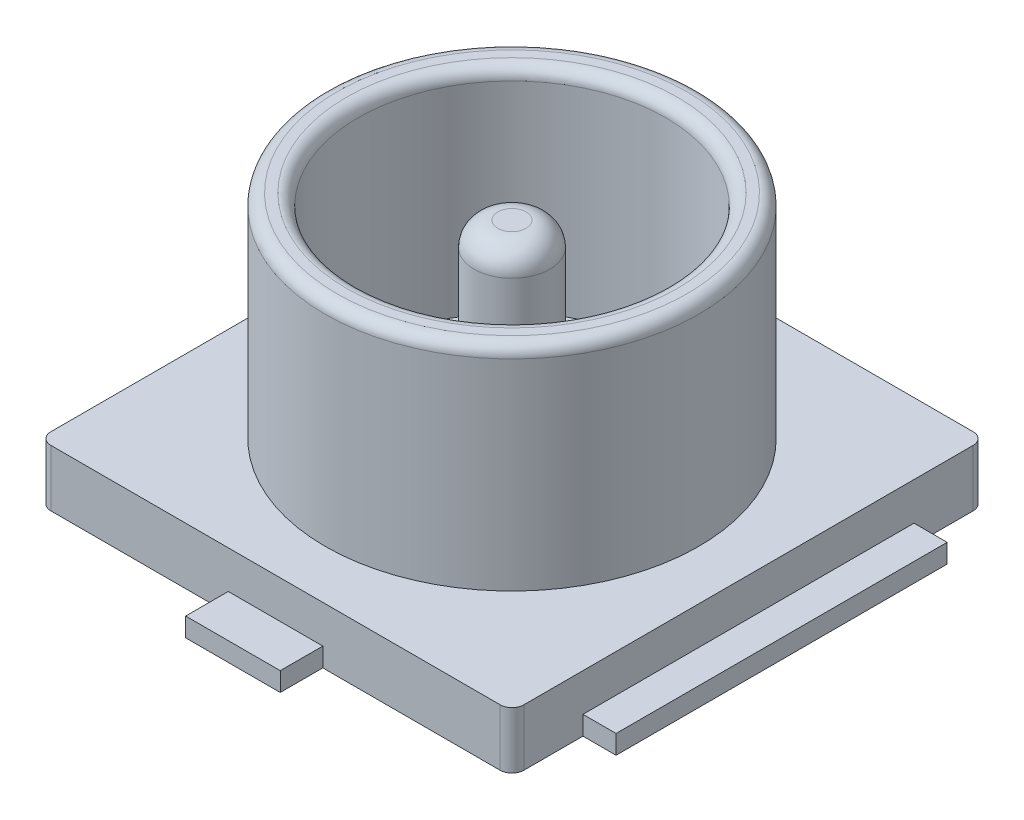
ISO-10303-21;
HEADER;
FILE_DESCRIPTION(('STEP AP214'),'2;1');
FILE_NAME('part.step','',(''),(''),'','','');
FILE_SCHEMA(('AUTOMOTIVE_DESIGN { 1 0 10303 214 1 1 1 1 }'));
ENDSEC;
DATA;
#1=APPLICATION_CONTEXT('core data for automotive mechanical design processes');
#2=APPLICATION_PROTOCOL_DEFINITION('international standard','automotive_design',2000,#1);
#3=PRODUCT_CONTEXT('',#1,'mechanical');
#4=PRODUCT('Part','Part','',(#3));
#5=PRODUCT_RELATED_PRODUCT_CATEGORY('part','',(#4));
#6=PRODUCT_DEFINITION_FORMATION('','',#4);
#7=PRODUCT_DEFINITION_CONTEXT('part definition',#1,'design');
#8=PRODUCT_DEFINITION('design','',#6,#7);
#9=PRODUCT_DEFINITION_SHAPE('','',#8);
#10=(LENGTH_UNIT() NAMED_UNIT(*) SI_UNIT(.MILLI.,.METRE.));
#11=(NAMED_UNIT(*) PLANE_ANGLE_UNIT() SI_UNIT($,.RADIAN.));
#12=(NAMED_UNIT(*) SI_UNIT($,.STERADIAN.) SOLID_ANGLE_UNIT());
#13=UNCERTAINTY_MEASURE_WITH_UNIT(LENGTH_MEASURE(1.E-05),#10,'distance_accuracy_value','');
#14=(GEOMETRIC_REPRESENTATION_CONTEXT(3) GLOBAL_UNCERTAINTY_ASSIGNED_CONTEXT((#13)) GLOBAL_UNIT_ASSIGNED_CONTEXT((#10,
#11,#12)) REPRESENTATION_CONTEXT('',''));
#15=CARTESIAN_POINT('',(0.,0.,0.));
#16=DIRECTION('',(0.,0.,1.));
#17=DIRECTION('',(1.,0.,0.));
#18=AXIS2_PLACEMENT_3D('',#15,#16,#17);
#19=CARTESIAN_POINT('',(-1.27,0.3048,-1.27));
#20=DIRECTION('',(1.,0.,0.));
#21=DIRECTION('',(0.,0.,-1.));
#22=AXIS2_PLACEMENT_3D('',#19,#20,#21);
#23=PLANE('',#22);
#24=DIRECTION('',(0.,-1.,0.));
#25=VECTOR('',#24,1.);
#26=CARTESIAN_POINT('',(-1.27,0.1016,-0.889));
#27=LINE('',#26,#25);
#28=CARTESIAN_POINT('',(-1.27,0.1016,-0.889));
#29=VERTEX_POINT('',#28);
#30=CARTESIAN_POINT('',(-1.27,0.,-0.889));
#31=VERTEX_POINT('',#30);
#32=EDGE_CURVE('E53',#29,#31,#27,.T.);
#33=ORIENTED_EDGE('',*,*,#32,.F.);
#34=DIRECTION('',(0.,0.,-1.));
#35=VECTOR('',#34,1.);
#36=CARTESIAN_POINT('',(-1.27,0.1016,0.889));
#37=LINE('',#36,#35);
#38=CARTESIAN_POINT('',(-1.27,0.1016,0.889));
#39=VERTEX_POINT('',#38);
#40=EDGE_CURVE('E48',#39,#29,#37,.T.);
#41=ORIENTED_EDGE('',*,*,#40,.F.);
#42=DIRECTION('',(0.,-1.,0.));
#43=VECTOR('',#42,1.);
#44=CARTESIAN_POINT('',(-1.27,0.1016,0.889));
#45=LINE('',#44,#43);
#46=CARTESIAN_POINT('',(-1.27,0.,0.889));
#47=VERTEX_POINT('',#46);
#48=EDGE_CURVE('E190',#39,#47,#45,.T.);
#49=ORIENTED_EDGE('',*,*,#48,.T.);
#50=DIRECTION('',(0.,0.,1.));
#51=VECTOR('',#50,1.);
#52=CARTESIAN_POINT('',(-1.27,0.,-1.27));
#53=LINE('',#52,#51);
#54=CARTESIAN_POINT('',(-1.27,0.,1.2065));
#55=VERTEX_POINT('',#54);
#56=EDGE_CURVE('E289',#47,#55,#53,.T.);
#57=ORIENTED_EDGE('',*,*,#56,.T.);
#58=DIRECTION('',(0.,-1.,0.));
#59=VECTOR('',#58,1.);
#60=CARTESIAN_POINT('',(-1.27,0.3048,1.2065));
#61=LINE('',#60,#59);
#62=CARTESIAN_POINT('',(-1.27,0.3048,1.2065));
#63=VERTEX_POINT('',#62);
#64=EDGE_CURVE('E283',#55,#63,#61,.F.);
#65=ORIENTED_EDGE('',*,*,#64,.T.);
#66=DIRECTION('',(0.,0.,1.));
#67=VECTOR('',#66,1.);
#68=CARTESIAN_POINT('',(-1.27,0.3048,-1.27));
#69=LINE('',#68,#67);
#70=CARTESIAN_POINT('',(-1.27,0.3048,-1.2065));
#71=VERTEX_POINT('',#70);
#72=EDGE_CURVE('E277',#71,#63,#69,.T.);
#73=ORIENTED_EDGE('',*,*,#72,.F.);
#74=DIRECTION('',(0.,-1.,0.));
#75=VECTOR('',#74,1.);
#76=CARTESIAN_POINT('',(-1.27,0.3048,-1.2065));
#77=LINE('',#76,#75);
#78=CARTESIAN_POINT('',(-1.27,0.,-1.2065));
#79=VERTEX_POINT('',#78);
#80=EDGE_CURVE('E295',#71,#79,#77,.T.);
#81=ORIENTED_EDGE('',*,*,#80,.T.);
#82=EDGE_CURVE('E290',#79,#31,#53,.T.);
#83=ORIENTED_EDGE('',*,*,#82,.T.);
#84=EDGE_LOOP('',(#33,#41,#49,#57,#65,#73,#81,#83));
#85=FACE_BOUND('',#84,.T.);
#86=ADVANCED_FACE('F33',(#85),#23,.F.);
#87=CARTESIAN_POINT('',(1.27,0.3048,-1.27));
#88=DIRECTION('',(-1.,0.,0.));
#89=DIRECTION('',(0.,0.,1.));
#90=AXIS2_PLACEMENT_3D('',#87,#88,#89);
#91=PLANE('',#90);
#92=DIRECTION('',(0.,-1.,0.));
#93=VECTOR('',#92,1.);
#94=CARTESIAN_POINT('',(1.27,0.1016,0.889));
#95=LINE('',#94,#93);
#96=CARTESIAN_POINT('',(1.27,0.1016,0.889));
#97=VERTEX_POINT('',#96);
#98=CARTESIAN_POINT('',(1.27,0.,0.889));
#99=VERTEX_POINT('',#98);
#100=EDGE_CURVE('E229',#97,#99,#95,.T.);
#101=ORIENTED_EDGE('',*,*,#100,.F.);
#102=DIRECTION('',(0.,0.,1.));
#103=VECTOR('',#102,1.);
#104=CARTESIAN_POINT('',(1.27,0.1016,0.889));
#105=LINE('',#104,#103);
#106=CARTESIAN_POINT('',(1.27,0.1016,-0.889000000000001));
#107=VERTEX_POINT('',#106);
#108=EDGE_CURVE('E204',#107,#97,#105,.T.);
#109=ORIENTED_EDGE('',*,*,#108,.F.);
#110=DIRECTION('',(0.,-1.,0.));
#111=VECTOR('',#110,1.);
#112=CARTESIAN_POINT('',(1.27,0.1016,-0.889000000000001));
#113=LINE('',#112,#111);
#114=CARTESIAN_POINT('',(1.27,0.,-0.889000000000001));
#115=VERTEX_POINT('',#114);
#116=EDGE_CURVE('E215',#107,#115,#113,.T.);
#117=ORIENTED_EDGE('',*,*,#116,.T.);
#118=DIRECTION('',(0.,0.,-1.));
#119=VECTOR('',#118,1.);
#120=CARTESIAN_POINT('',(1.27,0.,-1.27));
#121=LINE('',#120,#119);
#122=CARTESIAN_POINT('',(1.27,0.,-1.2065));
#123=VERTEX_POINT('',#122);
#124=EDGE_CURVE('E269',#115,#123,#121,.T.);
#125=ORIENTED_EDGE('',*,*,#124,.T.);
#126=DIRECTION('',(0.,-1.,0.));
#127=VECTOR('',#126,1.);
#128=CARTESIAN_POINT('',(1.27,0.3048,-1.2065));
#129=LINE('',#128,#127);
#130=CARTESIAN_POINT('',(1.27,0.3048,-1.2065));
#131=VERTEX_POINT('',#130);
#132=EDGE_CURVE('E325',#123,#131,#129,.F.);
#133=ORIENTED_EDGE('',*,*,#132,.T.);
#134=DIRECTION('',(0.,0.,-1.));
#135=VECTOR('',#134,1.);
#136=CARTESIAN_POINT('',(1.27,0.3048,-1.27));
#137=LINE('',#136,#135);
#138=CARTESIAN_POINT('',(1.27,0.3048,1.2065));
#139=VERTEX_POINT('',#138);
#140=EDGE_CURVE('E270',#139,#131,#137,.T.);
#141=ORIENTED_EDGE('',*,*,#140,.F.);
#142=DIRECTION('',(0.,-1.,0.));
#143=VECTOR('',#142,1.);
#144=CARTESIAN_POINT('',(1.27,0.3048,1.2065));
#145=LINE('',#144,#143);
#146=CARTESIAN_POINT('',(1.27,0.,1.2065));
#147=VERTEX_POINT('',#146);
#148=EDGE_CURVE('E322',#139,#147,#145,.T.);
#149=ORIENTED_EDGE('',*,*,#148,.T.);
#150=EDGE_CURVE('E284',#147,#99,#121,.T.);
#151=ORIENTED_EDGE('',*,*,#150,.T.);
#152=EDGE_LOOP('',(#101,#109,#117,#125,#133,#141,#149,#151));
#153=FACE_BOUND('',#152,.T.);
#154=ADVANCED_FACE('F365',(#153),#91,.F.);
#155=CARTESIAN_POINT('',(-1.27,0.3048,1.27));
#156=DIRECTION('',(0.,0.,-1.));
#157=DIRECTION('',(-1.,0.,0.));
#158=AXIS2_PLACEMENT_3D('',#155,#156,#157);
#159=PLANE('',#158);
#160=DIRECTION('',(0.,-1.,0.));
#161=VECTOR('',#160,1.);
#162=CARTESIAN_POINT('',(-0.254,0.1016,1.27));
#163=LINE('',#162,#161);
#164=CARTESIAN_POINT('',(-0.254,0.1016,1.27));
#165=VERTEX_POINT('',#164);
#166=CARTESIAN_POINT('',(-0.254,0.,1.27));
#167=VERTEX_POINT('',#166);
#168=EDGE_CURVE('E245',#165,#167,#163,.T.);
#169=ORIENTED_EDGE('',*,*,#168,.F.);
#170=DIRECTION('',(-1.,0.,0.));
#171=VECTOR('',#170,1.);
#172=CARTESIAN_POINT('',(-0.254,0.1016,1.27));
#173=LINE('',#172,#171);
#174=CARTESIAN_POINT('',(0.254,0.1016,1.27));
#175=VERTEX_POINT('',#174);
#176=EDGE_CURVE('E242',#175,#165,#173,.T.);
#177=ORIENTED_EDGE('',*,*,#176,.F.);
#178=DIRECTION('',(0.,-1.,0.));
#179=VECTOR('',#178,1.);
#180=CARTESIAN_POINT('',(0.254,0.1016,1.27));
#181=LINE('',#180,#179);
#182=CARTESIAN_POINT('',(0.254,0.,1.27));
#183=VERTEX_POINT('',#182);
#184=EDGE_CURVE('E254',#175,#183,#181,.T.);
#185=ORIENTED_EDGE('',*,*,#184,.T.);
#186=DIRECTION('',(1.,0.,0.));
#187=VECTOR('',#186,1.);
#188=CARTESIAN_POINT('',(-1.27,0.,1.27));
#189=LINE('',#188,#187);
#190=CARTESIAN_POINT('',(1.2065,0.,1.27));
#191=VERTEX_POINT('',#190);
#192=EDGE_CURVE('E292',#183,#191,#189,.T.);
#193=ORIENTED_EDGE('',*,*,#192,.T.);
#194=DIRECTION('',(0.,-1.,0.));
#195=VECTOR('',#194,1.);
#196=CARTESIAN_POINT('',(1.2065,0.3048,1.27));
#197=LINE('',#196,#195);
#198=CARTESIAN_POINT('',(1.2065,0.3048,1.27));
#199=VERTEX_POINT('',#198);
#200=EDGE_CURVE('E330',#191,#199,#197,.F.);
#201=ORIENTED_EDGE('',*,*,#200,.T.);
#202=DIRECTION('',(1.,0.,0.));
#203=VECTOR('',#202,1.);
#204=CARTESIAN_POINT('',(-1.27,0.3048,1.27));
#205=LINE('',#204,#203);
#206=CARTESIAN_POINT('',(-1.2065,0.3048,1.27));
#207=VERTEX_POINT('',#206);
#208=EDGE_CURVE('E280',#207,#199,#205,.T.);
#209=ORIENTED_EDGE('',*,*,#208,.F.);
#210=DIRECTION('',(0.,-1.,0.));
#211=VECTOR('',#210,1.);
#212=CARTESIAN_POINT('',(-1.2065,0.3048,1.27));
#213=LINE('',#212,#211);
#214=CARTESIAN_POINT('',(-1.2065,0.,1.27));
#215=VERTEX_POINT('',#214);
#216=EDGE_CURVE('E327',#207,#215,#213,.T.);
#217=ORIENTED_EDGE('',*,*,#216,.T.);
#218=EDGE_CURVE('E274',#215,#167,#189,.T.);
#219=ORIENTED_EDGE('',*,*,#218,.T.);
#220=EDGE_LOOP('',(#169,#177,#185,#193,#201,#209,#217,#219));
#221=FACE_BOUND('',#220,.T.);
#222=ADVANCED_FACE('F370',(#221),#159,.F.);
#223=CARTESIAN_POINT('',(-1.27,0.3048,-1.27));
#224=DIRECTION('',(0.,0.,1.));
#225=DIRECTION('',(1.,0.,0.));
#226=AXIS2_PLACEMENT_3D('',#223,#224,#225);
#227=PLANE('',#226);
#228=DIRECTION('',(-1.,0.,0.));
#229=VECTOR('',#228,1.);
#230=CARTESIAN_POINT('',(-1.27,0.,-1.27));
#231=LINE('',#230,#229);
#232=CARTESIAN_POINT('',(1.2065,0.,-1.27));
#233=VERTEX_POINT('',#232);
#234=CARTESIAN_POINT('',(-1.2065,0.,-1.27));
#235=VERTEX_POINT('',#234);
#236=EDGE_CURVE('E286',#233,#235,#231,.T.);
#237=ORIENTED_EDGE('',*,*,#236,.T.);
#238=DIRECTION('',(0.,-1.,0.));
#239=VECTOR('',#238,1.);
#240=CARTESIAN_POINT('',(-1.2065,0.3048,-1.27));
#241=LINE('',#240,#239);
#242=CARTESIAN_POINT('',(-1.2065,0.3048,-1.27));
#243=VERTEX_POINT('',#242);
#244=EDGE_CURVE('E312',#235,#243,#241,.F.);
#245=ORIENTED_EDGE('',*,*,#244,.T.);
#246=DIRECTION('',(-1.,0.,0.));
#247=VECTOR('',#246,1.);
#248=CARTESIAN_POINT('',(-1.27,0.3048,-1.27));
#249=LINE('',#248,#247);
#250=CARTESIAN_POINT('',(1.2065,0.3048,-1.27));
#251=VERTEX_POINT('',#250);
#252=EDGE_CURVE('E273',#251,#243,#249,.T.);
#253=ORIENTED_EDGE('',*,*,#252,.F.);
#254=DIRECTION('',(0.,-1.,0.));
#255=VECTOR('',#254,1.);
#256=CARTESIAN_POINT('',(1.2065,0.3048,-1.27));
#257=LINE('',#256,#255);
#258=EDGE_CURVE('E309',#251,#233,#257,.T.);
#259=ORIENTED_EDGE('',*,*,#258,.T.);
#260=EDGE_LOOP('',(#237,#245,#253,#259));
#261=FACE_BOUND('',#260,.T.);
#262=ADVANCED_FACE('F376',(#261),#227,.F.);
#263=CARTESIAN_POINT('',(0.,0.3048,0.));
#264=DIRECTION('',(0.,1.,0.));
#265=DIRECTION('',(0.,0.,1.));
#266=AXIS2_PLACEMENT_3D('',#263,#264,#265);
#267=PLANE('',#266);
#268=CARTESIAN_POINT('',(0.,0.3048,0.));
#269=DIRECTION('',(0.,1.,0.));
#270=DIRECTION('',(0.,0.,1.));
#271=AXIS2_PLACEMENT_3D('',#268,#269,#270);
#272=CIRCLE('',#271,1.0033);
#273=CARTESIAN_POINT('',(0.,0.3048,1.0033));
#274=VERTEX_POINT('',#273);
#275=EDGE_CURVE('E266',#274,#274,#272,.T.);
#276=ORIENTED_EDGE('',*,*,#275,.F.);
#277=EDGE_LOOP('',(#276));
#278=FACE_BOUND('',#277,.T.);
#279=ORIENTED_EDGE('',*,*,#252,.T.);
#280=CARTESIAN_POINT('',(-1.2065,0.3048,-1.2065));
#281=DIRECTION('',(0.,1.,0.));
#282=DIRECTION('',(0.,0.,1.));
#283=AXIS2_PLACEMENT_3D('',#280,#281,#282);
#284=CIRCLE('',#283,0.0635);
#285=EDGE_CURVE('E320',#243,#71,#284,.T.);
#286=ORIENTED_EDGE('',*,*,#285,.T.);
#287=ORIENTED_EDGE('',*,*,#72,.T.);
#288=CARTESIAN_POINT('',(-1.2065,0.3048,1.2065));
#289=DIRECTION('',(0.,1.,0.));
#290=DIRECTION('',(0.,0.,1.));
#291=AXIS2_PLACEMENT_3D('',#288,#289,#290);
#292=CIRCLE('',#291,0.0635);
#293=EDGE_CURVE('E314',#63,#207,#292,.T.);
#294=ORIENTED_EDGE('',*,*,#293,.T.);
#295=ORIENTED_EDGE('',*,*,#208,.T.);
#296=CARTESIAN_POINT('',(1.2065,0.3048,1.2065));
#297=DIRECTION('',(0.,1.,0.));
#298=DIRECTION('',(0.,0.,1.));
#299=AXIS2_PLACEMENT_3D('',#296,#297,#298);
#300=CIRCLE('',#299,0.0635);
#301=EDGE_CURVE('E316',#199,#139,#300,.T.);
#302=ORIENTED_EDGE('',*,*,#301,.T.);
#303=ORIENTED_EDGE('',*,*,#140,.T.);
#304=CARTESIAN_POINT('',(1.2065,0.3048,-1.2065));
#305=DIRECTION('',(0.,1.,0.));
#306=DIRECTION('',(0.,0.,1.));
#307=AXIS2_PLACEMENT_3D('',#304,#305,#306);
#308=CIRCLE('',#307,0.0635);
#309=EDGE_CURVE('E318',#131,#251,#308,.T.);
#310=ORIENTED_EDGE('',*,*,#309,.T.);
#311=EDGE_LOOP('',(#279,#286,#287,#294,#295,#302,#303,#310));
#312=FACE_BOUND('',#311,.T.);
#313=ADVANCED_FACE('F378',(#278,#312),#267,.T.);
#314=CARTESIAN_POINT('',(0.,0.,0.));
#315=DIRECTION('',(0.,1.,0.));
#316=DIRECTION('',(0.,0.,1.));
#317=AXIS2_PLACEMENT_3D('',#314,#315,#316);
#318=PLANE('',#317);
#319=ORIENTED_EDGE('',*,*,#82,.F.);
#320=CARTESIAN_POINT('',(-1.2065,0.,-1.2065));
#321=DIRECTION('',(0.,1.,0.));
#322=DIRECTION('',(0.,0.,1.));
#323=AXIS2_PLACEMENT_3D('',#320,#321,#322);
#324=CIRCLE('',#323,0.0635);
#325=EDGE_CURVE('E307',#79,#235,#324,.F.);
#326=ORIENTED_EDGE('',*,*,#325,.T.);
#327=ORIENTED_EDGE('',*,*,#236,.F.);
#328=CARTESIAN_POINT('',(1.2065,0.,-1.2065));
#329=DIRECTION('',(0.,1.,0.));
#330=DIRECTION('',(0.,0.,1.));
#331=AXIS2_PLACEMENT_3D('',#328,#329,#330);
#332=CIRCLE('',#331,0.0635);
#333=EDGE_CURVE('E304',#233,#123,#332,.F.);
#334=ORIENTED_EDGE('',*,*,#333,.T.);
#335=ORIENTED_EDGE('',*,*,#124,.F.);
#336=DIRECTION('',(-1.,0.,0.));
#337=VECTOR('',#336,1.);
#338=CARTESIAN_POINT('',(1.27,0.,-0.889000000000001));
#339=LINE('',#338,#337);
#340=CARTESIAN_POINT('',(1.4478,0.,-0.889000000000001));
#341=VERTEX_POINT('',#340);
#342=EDGE_CURVE('E208',#341,#115,#339,.T.);
#343=ORIENTED_EDGE('',*,*,#342,.F.);
#344=DIRECTION('',(0.,0.,-1.));
#345=VECTOR('',#344,1.);
#346=CARTESIAN_POINT('',(1.4478,0.,0.889));
#347=LINE('',#346,#345);
#348=CARTESIAN_POINT('',(1.4478,0.,0.889));
#349=VERTEX_POINT('',#348);
#350=EDGE_CURVE('E217',#349,#341,#347,.T.);
#351=ORIENTED_EDGE('',*,*,#350,.F.);
#352=DIRECTION('',(1.,0.,0.));
#353=VECTOR('',#352,1.);
#354=CARTESIAN_POINT('',(1.27,0.,0.889));
#355=LINE('',#354,#353);
#356=EDGE_CURVE('E203',#99,#349,#355,.T.);
#357=ORIENTED_EDGE('',*,*,#356,.F.);
#358=ORIENTED_EDGE('',*,*,#150,.F.);
#359=CARTESIAN_POINT('',(1.2065,0.,1.2065));
#360=DIRECTION('',(0.,1.,0.));
#361=DIRECTION('',(0.,0.,1.));
#362=AXIS2_PLACEMENT_3D('',#359,#360,#361);
#363=CIRCLE('',#362,0.0635);
#364=EDGE_CURVE('E301',#147,#191,#363,.F.);
#365=ORIENTED_EDGE('',*,*,#364,.T.);
#366=ORIENTED_EDGE('',*,*,#192,.F.);
#367=DIRECTION('',(0.,0.,-1.));
#368=VECTOR('',#367,1.);
#369=CARTESIAN_POINT('',(0.254,0.,1.27));
#370=LINE('',#369,#368);
#371=CARTESIAN_POINT('',(0.254,0.,1.4986));
#372=VERTEX_POINT('',#371);
#373=EDGE_CURVE('E237',#372,#183,#370,.T.);
#374=ORIENTED_EDGE('',*,*,#373,.F.);
#375=DIRECTION('',(1.,0.,0.));
#376=VECTOR('',#375,1.);
#377=CARTESIAN_POINT('',(-0.254,0.,1.4986));
#378=LINE('',#377,#376);
#379=CARTESIAN_POINT('',(-0.254,0.,1.4986));
#380=VERTEX_POINT('',#379);
#381=EDGE_CURVE('E248',#380,#372,#378,.T.);
#382=ORIENTED_EDGE('',*,*,#381,.F.);
#383=DIRECTION('',(0.,0.,1.));
#384=VECTOR('',#383,1.);
#385=CARTESIAN_POINT('',(-0.254,0.,1.27));
#386=LINE('',#385,#384);
#387=EDGE_CURVE('E232',#167,#380,#386,.T.);
#388=ORIENTED_EDGE('',*,*,#387,.F.);
#389=ORIENTED_EDGE('',*,*,#218,.F.);
#390=CARTESIAN_POINT('',(-1.2065,0.,1.2065));
#391=DIRECTION('',(0.,1.,0.));
#392=DIRECTION('',(0.,0.,1.));
#393=AXIS2_PLACEMENT_3D('',#390,#391,#392);
#394=CIRCLE('',#393,0.0635);
#395=EDGE_CURVE('E298',#215,#55,#394,.F.);
#396=ORIENTED_EDGE('',*,*,#395,.T.);
#397=ORIENTED_EDGE('',*,*,#56,.F.);
#398=DIRECTION('',(1.,0.,0.));
#399=VECTOR('',#398,1.);
#400=CARTESIAN_POINT('',(-1.27,0.,0.889));
#401=LINE('',#400,#399);
#402=CARTESIAN_POINT('',(-1.4478,0.,0.889));
#403=VERTEX_POINT('',#402);
#404=EDGE_CURVE('E197',#403,#47,#401,.T.);
#405=ORIENTED_EDGE('',*,*,#404,.F.);
#406=DIRECTION('',(0.,0.,1.));
#407=VECTOR('',#406,1.);
#408=CARTESIAN_POINT('',(-1.4478,0.,0.889));
#409=LINE('',#408,#407);
#410=CARTESIAN_POINT('',(-1.4478,0.,-0.889));
#411=VERTEX_POINT('',#410);
#412=EDGE_CURVE('E195',#411,#403,#409,.T.);
#413=ORIENTED_EDGE('',*,*,#412,.F.);
#414=DIRECTION('',(-1.,0.,0.));
#415=VECTOR('',#414,1.);
#416=CARTESIAN_POINT('',(-1.27,0.,-0.889));
#417=LINE('',#416,#415);
#418=EDGE_CURVE('E180',#31,#411,#417,.T.);
#419=ORIENTED_EDGE('',*,*,#418,.F.);
#420=EDGE_LOOP('',(#319,#326,#327,#334,#335,#343,#351,#357,#358,#365,#366,#374,#382,#388,#389,
#396,#397,#405,#413,#419));
#421=FACE_BOUND('',#420,.T.);
#422=ADVANCED_FACE('F385',(#421),#318,.F.);
#423=CARTESIAN_POINT('',(-1.2065,0.3048,-1.2065));
#424=DIRECTION('',(0.,-1.,0.));
#425=DIRECTION('',(0.,0.,-1.));
#426=AXIS2_PLACEMENT_3D('',#423,#424,#425);
#427=CYLINDRICAL_SURFACE('',#426,0.0635);
#428=ORIENTED_EDGE('',*,*,#285,.F.);
#429=ORIENTED_EDGE('',*,*,#244,.F.);
#430=ORIENTED_EDGE('',*,*,#325,.F.);
#431=ORIENTED_EDGE('',*,*,#80,.F.);
#432=EDGE_LOOP('',(#428,#429,#430,#431));
#433=FACE_BOUND('',#432,.T.);
#434=ADVANCED_FACE('F381',(#433),#427,.T.);
#435=CARTESIAN_POINT('',(1.2065,0.3048,-1.2065));
#436=DIRECTION('',(0.,-1.,0.));
#437=DIRECTION('',(0.,0.,-1.));
#438=AXIS2_PLACEMENT_3D('',#435,#436,#437);
#439=CYLINDRICAL_SURFACE('',#438,0.0635);
#440=ORIENTED_EDGE('',*,*,#309,.F.);
#441=ORIENTED_EDGE('',*,*,#132,.F.);
#442=ORIENTED_EDGE('',*,*,#333,.F.);
#443=ORIENTED_EDGE('',*,*,#258,.F.);
#444=EDGE_LOOP('',(#440,#441,#442,#443));
#445=FACE_BOUND('',#444,.T.);
#446=ADVANCED_FACE('F384',(#445),#439,.T.);
#447=CARTESIAN_POINT('',(1.2065,0.3048,1.2065));
#448=DIRECTION('',(0.,-1.,0.));
#449=DIRECTION('',(0.,0.,-1.));
#450=AXIS2_PLACEMENT_3D('',#447,#448,#449);
#451=CYLINDRICAL_SURFACE('',#450,0.0635);
#452=ORIENTED_EDGE('',*,*,#301,.F.);
#453=ORIENTED_EDGE('',*,*,#200,.F.);
#454=ORIENTED_EDGE('',*,*,#364,.F.);
#455=ORIENTED_EDGE('',*,*,#148,.F.);
#456=EDGE_LOOP('',(#452,#453,#454,#455));
#457=FACE_BOUND('',#456,.T.);
#458=ADVANCED_FACE('F389',(#457),#451,.T.);
#459=CARTESIAN_POINT('',(-1.2065,0.3048,1.2065));
#460=DIRECTION('',(0.,-1.,0.));
#461=DIRECTION('',(0.,0.,-1.));
#462=AXIS2_PLACEMENT_3D('',#459,#460,#461);
#463=CYLINDRICAL_SURFACE('',#462,0.0635);
#464=ORIENTED_EDGE('',*,*,#293,.F.);
#465=ORIENTED_EDGE('',*,*,#64,.F.);
#466=ORIENTED_EDGE('',*,*,#395,.F.);
#467=ORIENTED_EDGE('',*,*,#216,.F.);
#468=EDGE_LOOP('',(#464,#465,#466,#467));
#469=FACE_BOUND('',#468,.T.);
#470=ADVANCED_FACE('F393',(#469),#463,.T.);
#471=CARTESIAN_POINT('',(0.,1.4478,0.));
#472=DIRECTION('',(0.,1.,0.));
#473=DIRECTION('',(0.,0.,1.));
#474=AXIS2_PLACEMENT_3D('',#471,#472,#473);
#475=PLANE('',#474);
#476=CARTESIAN_POINT('',(0.,1.4478,0.));
#477=DIRECTION('',(0.,1.,0.));
#478=DIRECTION('',(0.,0.,1.));
#479=AXIS2_PLACEMENT_3D('',#476,#477,#478);
#480=CIRCLE('',#479,0.889);
#481=CARTESIAN_POINT('',(0.,1.4478,0.889));
#482=VERTEX_POINT('',#481);
#483=EDGE_CURVE('E341',#482,#482,#480,.F.);
#484=ORIENTED_EDGE('',*,*,#483,.T.);
#485=EDGE_LOOP('',(#484));
#486=FACE_BOUND('',#485,.T.);
#487=CARTESIAN_POINT('',(0.,1.4478,0.));
#488=DIRECTION('',(0.,1.,0.));
#489=DIRECTION('',(0.,0.,1.));
#490=AXIS2_PLACEMENT_3D('',#487,#488,#489);
#491=CIRCLE('',#490,0.9398);
#492=CARTESIAN_POINT('',(0.,1.4478,0.9398));
#493=VERTEX_POINT('',#492);
#494=EDGE_CURVE('E338',#493,#493,#491,.T.);
#495=ORIENTED_EDGE('',*,*,#494,.T.);
#496=EDGE_LOOP('',(#495));
#497=FACE_BOUND('',#496,.T.);
#498=ADVANCED_FACE('F397',(#486,#497),#475,.T.);
#499=CARTESIAN_POINT('',(0.,1.4478,0.));
#500=DIRECTION('',(0.,-1.,0.));
#501=DIRECTION('',(0.,0.,-1.));
#502=AXIS2_PLACEMENT_3D('',#499,#500,#501);
#503=CYLINDRICAL_SURFACE('',#502,1.0033);
#504=CARTESIAN_POINT('',(0.,1.3843,0.));
#505=DIRECTION('',(0.,1.,0.));
#506=DIRECTION('',(0.,0.,1.));
#507=AXIS2_PLACEMENT_3D('',#504,#505,#506);
#508=CIRCLE('',#507,1.0033);
#509=CARTESIAN_POINT('',(0.,1.3843,1.0033));
#510=VERTEX_POINT('',#509);
#511=EDGE_CURVE('E344',#510,#510,#508,.F.);
#512=ORIENTED_EDGE('',*,*,#511,.T.);
#513=EDGE_LOOP('',(#512));
#514=FACE_BOUND('',#513,.T.);
#515=ORIENTED_EDGE('',*,*,#275,.T.);
#516=EDGE_LOOP('',(#515));
#517=FACE_BOUND('',#516,.T.);
#518=ADVANCED_FACE('F416',(#514,#517),#503,.T.);
#519=CARTESIAN_POINT('',(0.,1.4478,0.));
#520=DIRECTION('',(0.,-1.,0.));
#521=DIRECTION('',(0.,0.,-1.));
#522=AXIS2_PLACEMENT_3D('',#519,#520,#521);
#523=CYLINDRICAL_SURFACE('',#522,0.8255);
#524=CARTESIAN_POINT('',(0.,1.3843,0.));
#525=DIRECTION('',(0.,1.,0.));
#526=DIRECTION('',(0.,0.,1.));
#527=AXIS2_PLACEMENT_3D('',#524,#525,#526);
#528=CIRCLE('',#527,0.8255);
#529=CARTESIAN_POINT('',(0.,1.3843,0.8255));
#530=VERTEX_POINT('',#529);
#531=EDGE_CURVE('E335',#530,#530,#528,.T.);
#532=ORIENTED_EDGE('',*,*,#531,.T.);
#533=EDGE_LOOP('',(#532));
#534=FACE_BOUND('',#533,.T.);
#535=CARTESIAN_POINT('',(0.,0.3048,0.));
#536=DIRECTION('',(0.,1.,0.));
#537=DIRECTION('',(0.,0.,1.));
#538=AXIS2_PLACEMENT_3D('',#535,#536,#537);
#539=CIRCLE('',#538,0.8255);
#540=CARTESIAN_POINT('',(0.,0.3048,0.8255));
#541=VERTEX_POINT('',#540);
#542=EDGE_CURVE('E332',#541,#541,#539,.F.);
#543=ORIENTED_EDGE('',*,*,#542,.T.);
#544=EDGE_LOOP('',(#543));
#545=FACE_BOUND('',#544,.T.);
#546=ADVANCED_FACE('F422',(#534,#545),#523,.F.);
#547=CARTESIAN_POINT('',(0.,0.3048,0.));
#548=DIRECTION('',(0.,1.,0.));
#549=DIRECTION('',(0.,0.,1.));
#550=AXIS2_PLACEMENT_3D('',#547,#548,#549);
#551=CIRCLE('',#550,0.2032);
#552=CARTESIAN_POINT('',(0.,0.3048,0.2032));
#553=VERTEX_POINT('',#552);
#554=EDGE_CURVE('E263',#553,#553,#551,.T.);
#555=ORIENTED_EDGE('',*,*,#554,.F.);
#556=EDGE_LOOP('',(#555));
#557=FACE_BOUND('',#556,.T.);
#558=ORIENTED_EDGE('',*,*,#542,.F.);
#559=EDGE_LOOP('',(#558));
#560=FACE_BOUND('',#559,.T.);
#561=ADVANCED_FACE('F402',(#557,#560),#267,.T.);
#562=CARTESIAN_POINT('',(0.,1.3843,0.));
#563=DIRECTION('',(0.,1.,0.));
#564=DIRECTION('',(0.,0.,1.));
#565=AXIS2_PLACEMENT_3D('',#562,#563,#564);
#566=TOROIDAL_SURFACE('',#565,0.889,0.0635);
#567=ORIENTED_EDGE('',*,*,#483,.F.);
#568=EDGE_LOOP('',(#567));
#569=FACE_BOUND('',#568,.T.);
#570=ORIENTED_EDGE('',*,*,#531,.F.);
#571=EDGE_LOOP('',(#570));
#572=FACE_BOUND('',#571,.T.);
#573=ADVANCED_FACE('F399',(#569,#572),#566,.T.);
#574=CARTESIAN_POINT('',(0.,1.3843,0.));
#575=DIRECTION('',(0.,1.,0.));
#576=DIRECTION('',(0.,0.,1.));
#577=AXIS2_PLACEMENT_3D('',#574,#575,#576);
#578=TOROIDAL_SURFACE('',#577,0.9398,0.0635);
#579=ORIENTED_EDGE('',*,*,#511,.F.);
#580=EDGE_LOOP('',(#579));
#581=FACE_BOUND('',#580,.T.);
#582=ORIENTED_EDGE('',*,*,#494,.F.);
#583=EDGE_LOOP('',(#582));
#584=FACE_BOUND('',#583,.T.);
#585=ADVANCED_FACE('F401',(#581,#584),#578,.T.);
#586=CARTESIAN_POINT('',(0.,1.3208,0.));
#587=DIRECTION('',(0.,-1.,0.));
#588=DIRECTION('',(0.,0.,-1.));
#589=AXIS2_PLACEMENT_3D('',#586,#587,#588);
#590=CYLINDRICAL_SURFACE('',#589,0.2032);
#591=CARTESIAN_POINT('',(0.,1.1938,0.));
#592=DIRECTION('',(0.,1.,0.));
#593=DIRECTION('',(0.,0.,1.));
#594=AXIS2_PLACEMENT_3D('',#591,#592,#593);
#595=CIRCLE('',#594,0.2032);
#596=CARTESIAN_POINT('',(0.,1.1938,0.2032));
#597=VERTEX_POINT('',#596);
#598=EDGE_CURVE('E11',#597,#597,#595,.F.);
#599=ORIENTED_EDGE('',*,*,#598,.T.);
#600=EDGE_LOOP('',(#599));
#601=FACE_BOUND('',#600,.T.);
#602=ORIENTED_EDGE('',*,*,#554,.T.);
#603=EDGE_LOOP('',(#602));
#604=FACE_BOUND('',#603,.T.);
#605=ADVANCED_FACE('F361',(#601,#604),#590,.T.);
#606=CARTESIAN_POINT('',(0.,1.3208,0.));
#607=DIRECTION('',(0.,1.,0.));
#608=DIRECTION('',(0.,0.,1.));
#609=AXIS2_PLACEMENT_3D('',#606,#607,#608);
#610=PLANE('',#609);
#611=CARTESIAN_POINT('',(0.,1.3208,0.));
#612=DIRECTION('',(0.,1.,0.));
#613=DIRECTION('',(0.,0.,1.));
#614=AXIS2_PLACEMENT_3D('',#611,#612,#613);
#615=CIRCLE('',#614,0.0762);
#616=CARTESIAN_POINT('',(0.,1.3208,0.0762));
#617=VERTEX_POINT('',#616);
#618=EDGE_CURVE('E41',#617,#617,#615,.T.);
#619=ORIENTED_EDGE('',*,*,#618,.T.);
#620=EDGE_LOOP('',(#619));
#621=FACE_BOUND('',#620,.T.);
#622=ADVANCED_FACE('F349',(#621),#610,.T.);
#623=CARTESIAN_POINT('',(0.,1.1938,0.));
#624=DIRECTION('',(0.,1.,0.));
#625=DIRECTION('',(0.,0.,1.));
#626=AXIS2_PLACEMENT_3D('',#623,#624,#625);
#627=DEGENERATE_TOROIDAL_SURFACE('',#626,0.0762,0.127,.T.);
#628=ORIENTED_EDGE('',*,*,#598,.F.);
#629=EDGE_LOOP('',(#628));
#630=FACE_BOUND('',#629,.T.);
#631=ORIENTED_EDGE('',*,*,#618,.F.);
#632=EDGE_LOOP('',(#631));
#633=FACE_BOUND('',#632,.T.);
#634=ADVANCED_FACE('F35',(#630,#633),#627,.T.);
#635=CARTESIAN_POINT('',(-0.254,0.1016,1.27));
#636=DIRECTION('',(1.,0.,0.));
#637=DIRECTION('',(0.,0.,-1.));
#638=AXIS2_PLACEMENT_3D('',#635,#636,#637);
#639=PLANE('',#638);
#640=ORIENTED_EDGE('',*,*,#387,.T.);
#641=DIRECTION('',(0.,-1.,0.));
#642=VECTOR('',#641,1.);
#643=CARTESIAN_POINT('',(-0.254,0.1016,1.4986));
#644=LINE('',#643,#642);
#645=CARTESIAN_POINT('',(-0.254,0.1016,1.4986));
#646=VERTEX_POINT('',#645);
#647=EDGE_CURVE('E260',#646,#380,#644,.T.);
#648=ORIENTED_EDGE('',*,*,#647,.F.);
#649=DIRECTION('',(0.,0.,1.));
#650=VECTOR('',#649,1.);
#651=CARTESIAN_POINT('',(-0.254,0.1016,1.27));
#652=LINE('',#651,#650);
#653=EDGE_CURVE('E233',#165,#646,#652,.T.);
#654=ORIENTED_EDGE('',*,*,#653,.F.);
#655=ORIENTED_EDGE('',*,*,#168,.T.);
#656=EDGE_LOOP('',(#640,#648,#654,#655));
#657=FACE_BOUND('',#656,.T.);
#658=ADVANCED_FACE('F352',(#657),#639,.F.);
#659=CARTESIAN_POINT('',(-0.254,0.1016,1.4986));
#660=DIRECTION('',(0.,0.,-1.));
#661=DIRECTION('',(-1.,0.,0.));
#662=AXIS2_PLACEMENT_3D('',#659,#660,#661);
#663=PLANE('',#662);
#664=ORIENTED_EDGE('',*,*,#381,.T.);
#665=DIRECTION('',(0.,-1.,0.));
#666=VECTOR('',#665,1.);
#667=CARTESIAN_POINT('',(0.254,0.1016,1.4986));
#668=LINE('',#667,#666);
#669=CARTESIAN_POINT('',(0.254,0.1016,1.4986));
#670=VERTEX_POINT('',#669);
#671=EDGE_CURVE('E257',#670,#372,#668,.T.);
#672=ORIENTED_EDGE('',*,*,#671,.F.);
#673=DIRECTION('',(1.,0.,0.));
#674=VECTOR('',#673,1.);
#675=CARTESIAN_POINT('',(-0.254,0.1016,1.4986));
#676=LINE('',#675,#674);
#677=EDGE_CURVE('E236',#646,#670,#676,.T.);
#678=ORIENTED_EDGE('',*,*,#677,.F.);
#679=ORIENTED_EDGE('',*,*,#647,.T.);
#680=EDGE_LOOP('',(#664,#672,#678,#679));
#681=FACE_BOUND('',#680,.T.);
#682=ADVANCED_FACE('F358',(#681),#663,.F.);
#683=CARTESIAN_POINT('',(0.254,0.1016,1.27));
#684=DIRECTION('',(-1.,0.,0.));
#685=DIRECTION('',(0.,0.,1.));
#686=AXIS2_PLACEMENT_3D('',#683,#684,#685);
#687=PLANE('',#686);
#688=ORIENTED_EDGE('',*,*,#373,.T.);
#689=ORIENTED_EDGE('',*,*,#184,.F.);
#690=DIRECTION('',(0.,0.,-1.));
#691=VECTOR('',#690,1.);
#692=CARTESIAN_POINT('',(0.254,0.1016,1.27));
#693=LINE('',#692,#691);
#694=EDGE_CURVE('E239',#670,#175,#693,.T.);
#695=ORIENTED_EDGE('',*,*,#694,.F.);
#696=ORIENTED_EDGE('',*,*,#671,.T.);
#697=EDGE_LOOP('',(#688,#689,#695,#696));
#698=FACE_BOUND('',#697,.T.);
#699=ADVANCED_FACE('F469',(#698),#687,.F.);
#700=CARTESIAN_POINT('',(0.,0.1016,0.));
#701=DIRECTION('',(0.,1.,0.));
#702=DIRECTION('',(0.,0.,1.));
#703=AXIS2_PLACEMENT_3D('',#700,#701,#702);
#704=PLANE('',#703);
#705=ORIENTED_EDGE('',*,*,#653,.T.);
#706=ORIENTED_EDGE('',*,*,#677,.T.);
#707=ORIENTED_EDGE('',*,*,#694,.T.);
#708=ORIENTED_EDGE('',*,*,#176,.T.);
#709=EDGE_LOOP('',(#705,#706,#707,#708));
#710=FACE_BOUND('',#709,.T.);
#711=ADVANCED_FACE('F477',(#710),#704,.T.);
#712=CARTESIAN_POINT('',(1.27,0.1016,0.889));
#713=DIRECTION('',(0.,0.,-1.));
#714=DIRECTION('',(-1.,0.,0.));
#715=AXIS2_PLACEMENT_3D('',#712,#713,#714);
#716=PLANE('',#715);
#717=ORIENTED_EDGE('',*,*,#356,.T.);
#718=DIRECTION('',(0.,-1.,0.));
#719=VECTOR('',#718,1.);
#720=CARTESIAN_POINT('',(1.4478,0.1016,0.889));
#721=LINE('',#720,#719);
#722=CARTESIAN_POINT('',(1.4478,0.1016,0.889));
#723=VERTEX_POINT('',#722);
#724=EDGE_CURVE('E226',#723,#349,#721,.T.);
#725=ORIENTED_EDGE('',*,*,#724,.F.);
#726=DIRECTION('',(1.,0.,0.));
#727=VECTOR('',#726,1.);
#728=CARTESIAN_POINT('',(1.27,0.1016,0.889));
#729=LINE('',#728,#727);
#730=EDGE_CURVE('E207',#97,#723,#729,.T.);
#731=ORIENTED_EDGE('',*,*,#730,.F.);
#732=ORIENTED_EDGE('',*,*,#100,.T.);
#733=EDGE_LOOP('',(#717,#725,#731,#732));
#734=FACE_BOUND('',#733,.T.);
#735=ADVANCED_FACE('F460',(#734),#716,.F.);
#736=CARTESIAN_POINT('',(1.4478,0.1016,0.889));
#737=DIRECTION('',(-1.,0.,0.));
#738=DIRECTION('',(0.,0.,1.));
#739=AXIS2_PLACEMENT_3D('',#736,#737,#738);
#740=PLANE('',#739);
#741=ORIENTED_EDGE('',*,*,#350,.T.);
#742=DIRECTION('',(0.,-1.,0.));
#743=VECTOR('',#742,1.);
#744=CARTESIAN_POINT('',(1.4478,0.1016,-0.889000000000001));
#745=LINE('',#744,#743);
#746=CARTESIAN_POINT('',(1.4478,0.1016,-0.889000000000001));
#747=VERTEX_POINT('',#746);
#748=EDGE_CURVE('E223',#747,#341,#745,.T.);
#749=ORIENTED_EDGE('',*,*,#748,.F.);
#750=DIRECTION('',(0.,0.,-1.));
#751=VECTOR('',#750,1.);
#752=CARTESIAN_POINT('',(1.4478,0.1016,0.889));
#753=LINE('',#752,#751);
#754=EDGE_CURVE('E210',#723,#747,#753,.T.);
#755=ORIENTED_EDGE('',*,*,#754,.F.);
#756=ORIENTED_EDGE('',*,*,#724,.T.);
#757=EDGE_LOOP('',(#741,#749,#755,#756));
#758=FACE_BOUND('',#757,.T.);
#759=ADVANCED_FACE('F454',(#758),#740,.F.);
#760=CARTESIAN_POINT('',(1.27,0.1016,-0.889000000000001));
#761=DIRECTION('',(0.,0.,1.));
#762=DIRECTION('',(1.,0.,0.));
#763=AXIS2_PLACEMENT_3D('',#760,#761,#762);
#764=PLANE('',#763);
#765=ORIENTED_EDGE('',*,*,#342,.T.);
#766=ORIENTED_EDGE('',*,*,#116,.F.);
#767=DIRECTION('',(-1.,0.,0.));
#768=VECTOR('',#767,1.);
#769=CARTESIAN_POINT('',(1.27,0.1016,-0.889000000000001));
#770=LINE('',#769,#768);
#771=EDGE_CURVE('E212',#747,#107,#770,.T.);
#772=ORIENTED_EDGE('',*,*,#771,.F.);
#773=ORIENTED_EDGE('',*,*,#748,.T.);
#774=EDGE_LOOP('',(#765,#766,#772,#773));
#775=FACE_BOUND('',#774,.T.);
#776=ADVANCED_FACE('F450',(#775),#764,.F.);
#777=CARTESIAN_POINT('',(0.,0.1016,0.));
#778=DIRECTION('',(0.,-1.,0.));
#779=DIRECTION('',(0.,0.,-1.));
#780=AXIS2_PLACEMENT_3D('',#777,#778,#779);
#781=PLANE('',#780);
#782=ORIENTED_EDGE('',*,*,#108,.T.);
#783=ORIENTED_EDGE('',*,*,#730,.T.);
#784=ORIENTED_EDGE('',*,*,#754,.T.);
#785=ORIENTED_EDGE('',*,*,#771,.T.);
#786=EDGE_LOOP('',(#782,#783,#784,#785));
#787=FACE_BOUND('',#786,.T.);
#788=ADVANCED_FACE('F523',(#787),#781,.F.);
#789=CARTESIAN_POINT('',(-1.27,0.1016,-0.889));
#790=DIRECTION('',(0.,0.,1.));
#791=DIRECTION('',(1.,0.,0.));
#792=AXIS2_PLACEMENT_3D('',#789,#790,#791);
#793=PLANE('',#792);
#794=ORIENTED_EDGE('',*,*,#418,.T.);
#795=DIRECTION('',(0.,-1.,0.));
#796=VECTOR('',#795,1.);
#797=CARTESIAN_POINT('',(-1.4478,0.1016,-0.889));
#798=LINE('',#797,#796);
#799=CARTESIAN_POINT('',(-1.4478,0.1016,-0.889));
#800=VERTEX_POINT('',#799);
#801=EDGE_CURVE('E177',#800,#411,#798,.T.);
#802=ORIENTED_EDGE('',*,*,#801,.F.);
#803=DIRECTION('',(-1.,0.,0.));
#804=VECTOR('',#803,1.);
#805=CARTESIAN_POINT('',(-1.27,0.1016,-0.889));
#806=LINE('',#805,#804);
#807=EDGE_CURVE('E168',#29,#800,#806,.T.);
#808=ORIENTED_EDGE('',*,*,#807,.F.);
#809=ORIENTED_EDGE('',*,*,#32,.T.);
#810=EDGE_LOOP('',(#794,#802,#808,#809));
#811=FACE_BOUND('',#810,.T.);
#812=ADVANCED_FACE('F178',(#811),#793,.F.);
#813=CARTESIAN_POINT('',(-1.4478,0.1016,0.889));
#814=DIRECTION('',(1.,0.,0.));
#815=DIRECTION('',(0.,0.,-1.));
#816=AXIS2_PLACEMENT_3D('',#813,#814,#815);
#817=PLANE('',#816);
#818=ORIENTED_EDGE('',*,*,#412,.T.);
#819=DIRECTION('',(0.,-1.,0.));
#820=VECTOR('',#819,1.);
#821=CARTESIAN_POINT('',(-1.4478,0.1016,0.889));
#822=LINE('',#821,#820);
#823=CARTESIAN_POINT('',(-1.4478,0.1016,0.889));
#824=VERTEX_POINT('',#823);
#825=EDGE_CURVE('E183',#824,#403,#822,.T.);
#826=ORIENTED_EDGE('',*,*,#825,.F.);
#827=DIRECTION('',(0.,0.,1.));
#828=VECTOR('',#827,1.);
#829=CARTESIAN_POINT('',(-1.4478,0.1016,0.889));
#830=LINE('',#829,#828);
#831=EDGE_CURVE('E172',#800,#824,#830,.T.);
#832=ORIENTED_EDGE('',*,*,#831,.F.);
#833=ORIENTED_EDGE('',*,*,#801,.T.);
#834=EDGE_LOOP('',(#818,#826,#832,#833));
#835=FACE_BOUND('',#834,.T.);
#836=ADVANCED_FACE('F185',(#835),#817,.F.);
#837=CARTESIAN_POINT('',(-1.27,0.1016,0.889));
#838=DIRECTION('',(0.,0.,-1.));
#839=DIRECTION('',(-1.,0.,0.));
#840=AXIS2_PLACEMENT_3D('',#837,#838,#839);
#841=PLANE('',#840);
#842=ORIENTED_EDGE('',*,*,#404,.T.);
#843=ORIENTED_EDGE('',*,*,#48,.F.);
#844=DIRECTION('',(1.,0.,0.));
#845=VECTOR('',#844,1.);
#846=CARTESIAN_POINT('',(-1.27,0.1016,0.889));
#847=LINE('',#846,#845);
#848=EDGE_CURVE('E188',#824,#39,#847,.T.);
#849=ORIENTED_EDGE('',*,*,#848,.F.);
#850=ORIENTED_EDGE('',*,*,#825,.T.);
#851=EDGE_LOOP('',(#842,#843,#849,#850));
#852=FACE_BOUND('',#851,.T.);
#853=ADVANCED_FACE('F549',(#852),#841,.F.);
#854=CARTESIAN_POINT('',(0.,0.1016,0.));
#855=DIRECTION('',(0.,1.,0.));
#856=DIRECTION('',(0.,0.,1.));
#857=AXIS2_PLACEMENT_3D('',#854,#855,#856);
#858=PLANE('',#857);
#859=ORIENTED_EDGE('',*,*,#40,.T.);
#860=ORIENTED_EDGE('',*,*,#807,.T.);
#861=ORIENTED_EDGE('',*,*,#831,.T.);
#862=ORIENTED_EDGE('',*,*,#848,.T.);
#863=EDGE_LOOP('',(#859,#860,#861,#862));
#864=FACE_BOUND('',#863,.T.);
#865=ADVANCED_FACE('F170',(#864),#858,.T.);
#866=CLOSED_SHELL('',(#86,#154,#222,#262,#313,#422,#434,#446,#458,#470,#498,#518,#546,#561,#573,
#585,#605,#622,#634,#658,#682,#699,#711,#735,#759,#776,#788,#812,#836,#853,#865));
#867=MANIFOLD_SOLID_BREP('B2',#866);
#868=ADVANCED_BREP_SHAPE_REPRESENTATION('',(#18,#867),#14);
#869=SHAPE_DEFINITION_REPRESENTATION(#9,#868);
ENDSEC;
END-ISO-10303-21;
